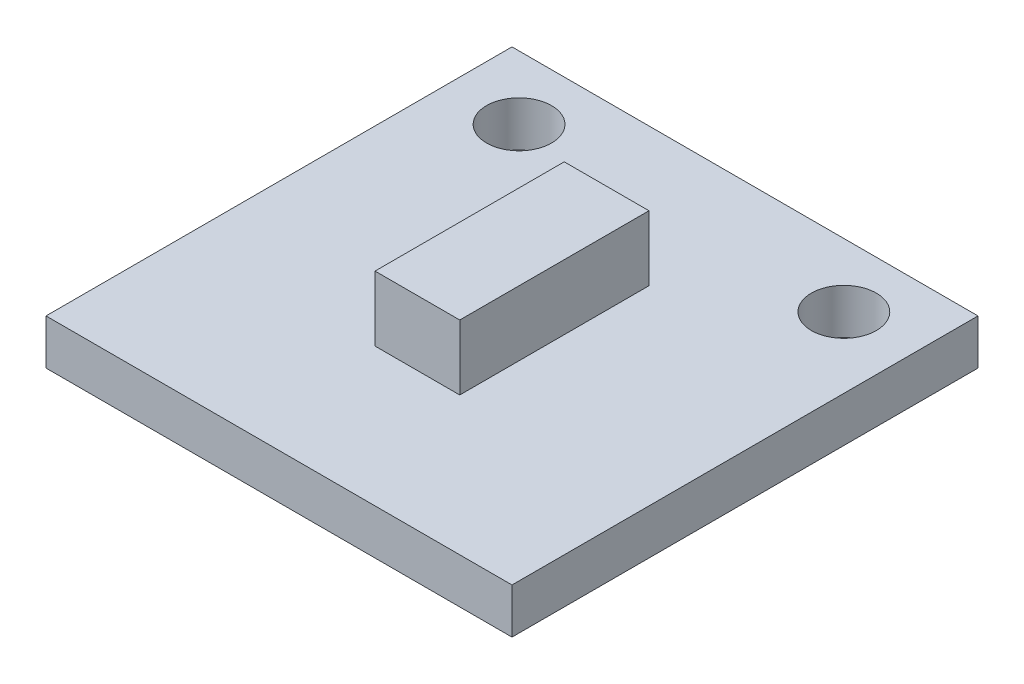
ISO-10303-21;
HEADER;
FILE_DESCRIPTION(('STEP AP214'),'2;1');
FILE_NAME('part.step','',(''),(''),'','','');
FILE_SCHEMA(('AUTOMOTIVE_DESIGN { 1 0 10303 214 1 1 1 1 }'));
ENDSEC;
DATA;
#1=APPLICATION_CONTEXT('core data for automotive mechanical design processes');
#2=APPLICATION_PROTOCOL_DEFINITION('international standard','automotive_design',2000,#1);
#3=PRODUCT_CONTEXT('',#1,'mechanical');
#4=PRODUCT('Part','Part','',(#3));
#5=PRODUCT_RELATED_PRODUCT_CATEGORY('part','',(#4));
#6=PRODUCT_DEFINITION_FORMATION('','',#4);
#7=PRODUCT_DEFINITION_CONTEXT('part definition',#1,'design');
#8=PRODUCT_DEFINITION('design','',#6,#7);
#9=PRODUCT_DEFINITION_SHAPE('','',#8);
#10=(LENGTH_UNIT() NAMED_UNIT(*) SI_UNIT(.MILLI.,.METRE.));
#11=(NAMED_UNIT(*) PLANE_ANGLE_UNIT() SI_UNIT($,.RADIAN.));
#12=(NAMED_UNIT(*) SI_UNIT($,.STERADIAN.) SOLID_ANGLE_UNIT());
#13=UNCERTAINTY_MEASURE_WITH_UNIT(LENGTH_MEASURE(1.E-05),#10,'distance_accuracy_value','');
#14=(GEOMETRIC_REPRESENTATION_CONTEXT(3) GLOBAL_UNCERTAINTY_ASSIGNED_CONTEXT((#13)) GLOBAL_UNIT_ASSIGNED_CONTEXT((#10,
#11,#12)) REPRESENTATION_CONTEXT('',''));
#15=CARTESIAN_POINT('',(0.,0.,0.));
#16=DIRECTION('',(0.,0.,1.));
#17=DIRECTION('',(1.,0.,0.));
#18=AXIS2_PLACEMENT_3D('',#15,#16,#17);
#19=CARTESIAN_POINT('',(0.,1.6,0.));
#20=DIRECTION('',(0.,-1.,0.));
#21=DIRECTION('',(0.,0.,-1.));
#22=AXIS2_PLACEMENT_3D('',#19,#20,#21);
#23=PLANE('',#22);
#24=CARTESIAN_POINT('',(5.75,1.6,-6.));
#25=DIRECTION('',(0.,1.,0.));
#26=DIRECTION('',(0.,0.,1.));
#27=AXIS2_PLACEMENT_3D('',#24,#25,#26);
#28=CIRCLE('',#27,1.15);
#29=CARTESIAN_POINT('',(5.75,1.6,-4.85));
#30=VERTEX_POINT('',#29);
#31=EDGE_CURVE('E120',#30,#30,#28,.T.);
#32=ORIENTED_EDGE('',*,*,#31,.F.);
#33=EDGE_LOOP('',(#32));
#34=FACE_BOUND('',#33,.T.);
#35=CARTESIAN_POINT('',(-5.75,1.6,-6.));
#36=DIRECTION('',(0.,1.,0.));
#37=DIRECTION('',(0.,0.,1.));
#38=AXIS2_PLACEMENT_3D('',#35,#36,#37);
#39=CIRCLE('',#38,1.15);
#40=CARTESIAN_POINT('',(-5.75,1.6,-4.85));
#41=VERTEX_POINT('',#40);
#42=EDGE_CURVE('E129',#41,#41,#39,.T.);
#43=ORIENTED_EDGE('',*,*,#42,.F.);
#44=EDGE_LOOP('',(#43));
#45=FACE_BOUND('',#44,.T.);
#46=DIRECTION('',(0.,0.,-1.));
#47=VECTOR('',#46,1.);
#48=CARTESIAN_POINT('',(8.25,1.6,8.25));
#49=LINE('',#48,#47);
#50=CARTESIAN_POINT('',(8.25,1.6,8.25));
#51=VERTEX_POINT('',#50);
#52=CARTESIAN_POINT('',(8.25,1.6,-8.25));
#53=VERTEX_POINT('',#52);
#54=EDGE_CURVE('E135',#51,#53,#49,.T.);
#55=ORIENTED_EDGE('',*,*,#54,.T.);
#56=DIRECTION('',(-1.,0.,0.));
#57=VECTOR('',#56,1.);
#58=CARTESIAN_POINT('',(-8.25,1.6,-8.25));
#59=LINE('',#58,#57);
#60=CARTESIAN_POINT('',(-8.25,1.6,-8.25));
#61=VERTEX_POINT('',#60);
#62=EDGE_CURVE('E138',#53,#61,#59,.T.);
#63=ORIENTED_EDGE('',*,*,#62,.T.);
#64=DIRECTION('',(0.,0.,1.));
#65=VECTOR('',#64,1.);
#66=CARTESIAN_POINT('',(-8.25,1.6,8.25));
#67=LINE('',#66,#65);
#68=CARTESIAN_POINT('',(-8.25,1.6,8.25));
#69=VERTEX_POINT('',#68);
#70=EDGE_CURVE('E141',#61,#69,#67,.T.);
#71=ORIENTED_EDGE('',*,*,#70,.T.);
#72=DIRECTION('',(1.,0.,0.));
#73=VECTOR('',#72,1.);
#74=CARTESIAN_POINT('',(-8.25,1.6,8.25));
#75=LINE('',#74,#73);
#76=EDGE_CURVE('E143',#69,#51,#75,.T.);
#77=ORIENTED_EDGE('',*,*,#76,.T.);
#78=EDGE_LOOP('',(#55,#63,#71,#77));
#79=FACE_BOUND('',#78,.T.);
#80=DIRECTION('',(0.,0.,-1.));
#81=VECTOR('',#80,1.);
#82=CARTESIAN_POINT('',(1.5,1.6,3.35));
#83=LINE('',#82,#81);
#84=CARTESIAN_POINT('',(1.5,1.6,3.35));
#85=VERTEX_POINT('',#84);
#86=CARTESIAN_POINT('',(1.5,1.6,-3.35));
#87=VERTEX_POINT('',#86);
#88=EDGE_CURVE('E47',#85,#87,#83,.T.);
#89=ORIENTED_EDGE('',*,*,#88,.F.);
#90=DIRECTION('',(1.,0.,0.));
#91=VECTOR('',#90,1.);
#92=CARTESIAN_POINT('',(-1.5,1.6,3.35));
#93=LINE('',#92,#91);
#94=CARTESIAN_POINT('',(-1.5,1.6,3.35));
#95=VERTEX_POINT('',#94);
#96=EDGE_CURVE('E51',#95,#85,#93,.T.);
#97=ORIENTED_EDGE('',*,*,#96,.F.);
#98=DIRECTION('',(0.,0.,1.));
#99=VECTOR('',#98,1.);
#100=CARTESIAN_POINT('',(-1.5,1.6,3.35));
#101=LINE('',#100,#99);
#102=CARTESIAN_POINT('',(-1.5,1.6,-3.35));
#103=VERTEX_POINT('',#102);
#104=EDGE_CURVE('E300',#103,#95,#101,.T.);
#105=ORIENTED_EDGE('',*,*,#104,.F.);
#106=DIRECTION('',(-1.,0.,0.));
#107=VECTOR('',#106,1.);
#108=CARTESIAN_POINT('',(-1.5,1.6,-3.35));
#109=LINE('',#108,#107);
#110=EDGE_CURVE('E306',#87,#103,#109,.T.);
#111=ORIENTED_EDGE('',*,*,#110,.F.);
#112=EDGE_LOOP('',(#89,#97,#105,#111));
#113=FACE_BOUND('',#112,.T.);
#114=ADVANCED_FACE('F32',(#34,#45,#79,#113),#23,.F.);
#115=CARTESIAN_POINT('',(0.,0.,0.));
#116=DIRECTION('',(0.,-1.,0.));
#117=DIRECTION('',(0.,0.,-1.));
#118=AXIS2_PLACEMENT_3D('',#115,#116,#117);
#119=PLANE('',#118);
#120=CARTESIAN_POINT('',(-5.75,0.,-6.));
#121=DIRECTION('',(0.,1.,0.));
#122=DIRECTION('',(0.,0.,1.));
#123=AXIS2_PLACEMENT_3D('',#120,#121,#122);
#124=CIRCLE('',#123,1.15);
#125=CARTESIAN_POINT('',(-5.75,0.,-4.85));
#126=VERTEX_POINT('',#125);
#127=EDGE_CURVE('E127',#126,#126,#124,.T.);
#128=ORIENTED_EDGE('',*,*,#127,.T.);
#129=EDGE_LOOP('',(#128));
#130=FACE_BOUND('',#129,.T.);
#131=DIRECTION('',(0.,0.,-1.));
#132=VECTOR('',#131,1.);
#133=CARTESIAN_POINT('',(8.25,0.,8.25));
#134=LINE('',#133,#132);
#135=CARTESIAN_POINT('',(8.25,0.,8.25));
#136=VERTEX_POINT('',#135);
#137=CARTESIAN_POINT('',(8.25,0.,-8.25));
#138=VERTEX_POINT('',#137);
#139=EDGE_CURVE('E132',#136,#138,#134,.T.);
#140=ORIENTED_EDGE('',*,*,#139,.F.);
#141=DIRECTION('',(1.,0.,0.));
#142=VECTOR('',#141,1.);
#143=CARTESIAN_POINT('',(-8.25,0.,8.25));
#144=LINE('',#143,#142);
#145=CARTESIAN_POINT('',(-8.25,0.,8.25));
#146=VERTEX_POINT('',#145);
#147=EDGE_CURVE('E139',#146,#136,#144,.T.);
#148=ORIENTED_EDGE('',*,*,#147,.F.);
#149=DIRECTION('',(0.,0.,1.));
#150=VECTOR('',#149,1.);
#151=CARTESIAN_POINT('',(-8.25,0.,8.25));
#152=LINE('',#151,#150);
#153=CARTESIAN_POINT('',(-8.25,0.,-8.25));
#154=VERTEX_POINT('',#153);
#155=EDGE_CURVE('E150',#154,#146,#152,.T.);
#156=ORIENTED_EDGE('',*,*,#155,.F.);
#157=DIRECTION('',(-1.,0.,0.));
#158=VECTOR('',#157,1.);
#159=CARTESIAN_POINT('',(-8.25,0.,-8.25));
#160=LINE('',#159,#158);
#161=EDGE_CURVE('E148',#138,#154,#160,.T.);
#162=ORIENTED_EDGE('',*,*,#161,.F.);
#163=EDGE_LOOP('',(#140,#148,#156,#162));
#164=FACE_BOUND('',#163,.T.);
#165=CARTESIAN_POINT('',(5.75,0.,-6.));
#166=DIRECTION('',(0.,1.,0.));
#167=DIRECTION('',(0.,0.,1.));
#168=AXIS2_PLACEMENT_3D('',#165,#166,#167);
#169=CIRCLE('',#168,1.15);
#170=CARTESIAN_POINT('',(5.75,0.,-4.85));
#171=VERTEX_POINT('',#170);
#172=EDGE_CURVE('E117',#171,#171,#169,.T.);
#173=ORIENTED_EDGE('',*,*,#172,.T.);
#174=EDGE_LOOP('',(#173));
#175=FACE_BOUND('',#174,.T.);
#176=ADVANCED_FACE('F168',(#130,#164,#175),#119,.T.);
#177=CARTESIAN_POINT('',(8.25,1.6,8.25));
#178=DIRECTION('',(-1.,0.,0.));
#179=DIRECTION('',(0.,0.,1.));
#180=AXIS2_PLACEMENT_3D('',#177,#178,#179);
#181=PLANE('',#180);
#182=ORIENTED_EDGE('',*,*,#139,.T.);
#183=DIRECTION('',(0.,-1.,0.));
#184=VECTOR('',#183,1.);
#185=CARTESIAN_POINT('',(8.25,1.6,-8.25));
#186=LINE('',#185,#184);
#187=EDGE_CURVE('E11',#53,#138,#186,.T.);
#188=ORIENTED_EDGE('',*,*,#187,.F.);
#189=ORIENTED_EDGE('',*,*,#54,.F.);
#190=DIRECTION('',(0.,-1.,0.));
#191=VECTOR('',#190,1.);
#192=CARTESIAN_POINT('',(8.25,1.6,8.25));
#193=LINE('',#192,#191);
#194=EDGE_CURVE('E145',#51,#136,#193,.T.);
#195=ORIENTED_EDGE('',*,*,#194,.T.);
#196=EDGE_LOOP('',(#182,#188,#189,#195));
#197=FACE_BOUND('',#196,.T.);
#198=ADVANCED_FACE('F34',(#197),#181,.F.);
#199=CARTESIAN_POINT('',(-8.25,1.6,-8.25));
#200=DIRECTION('',(0.,0.,1.));
#201=DIRECTION('',(1.,0.,0.));
#202=AXIS2_PLACEMENT_3D('',#199,#200,#201);
#203=PLANE('',#202);
#204=ORIENTED_EDGE('',*,*,#161,.T.);
#205=DIRECTION('',(0.,-1.,0.));
#206=VECTOR('',#205,1.);
#207=CARTESIAN_POINT('',(-8.25,1.6,-8.25));
#208=LINE('',#207,#206);
#209=EDGE_CURVE('E40',#61,#154,#208,.T.);
#210=ORIENTED_EDGE('',*,*,#209,.F.);
#211=ORIENTED_EDGE('',*,*,#62,.F.);
#212=ORIENTED_EDGE('',*,*,#187,.T.);
#213=EDGE_LOOP('',(#204,#210,#211,#212));
#214=FACE_BOUND('',#213,.T.);
#215=ADVANCED_FACE('F178',(#214),#203,.F.);
#216=CARTESIAN_POINT('',(-8.25,1.6,8.25));
#217=DIRECTION('',(1.,0.,0.));
#218=DIRECTION('',(0.,0.,-1.));
#219=AXIS2_PLACEMENT_3D('',#216,#217,#218);
#220=PLANE('',#219);
#221=ORIENTED_EDGE('',*,*,#155,.T.);
#222=DIRECTION('',(0.,-1.,0.));
#223=VECTOR('',#222,1.);
#224=CARTESIAN_POINT('',(-8.25,1.6,8.25));
#225=LINE('',#224,#223);
#226=EDGE_CURVE('E155',#69,#146,#225,.T.);
#227=ORIENTED_EDGE('',*,*,#226,.F.);
#228=ORIENTED_EDGE('',*,*,#70,.F.);
#229=ORIENTED_EDGE('',*,*,#209,.T.);
#230=EDGE_LOOP('',(#221,#227,#228,#229));
#231=FACE_BOUND('',#230,.T.);
#232=ADVANCED_FACE('F162',(#231),#220,.F.);
#233=CARTESIAN_POINT('',(-8.25,1.6,8.25));
#234=DIRECTION('',(0.,0.,-1.));
#235=DIRECTION('',(-1.,0.,0.));
#236=AXIS2_PLACEMENT_3D('',#233,#234,#235);
#237=PLANE('',#236);
#238=ORIENTED_EDGE('',*,*,#147,.T.);
#239=ORIENTED_EDGE('',*,*,#194,.F.);
#240=ORIENTED_EDGE('',*,*,#76,.F.);
#241=ORIENTED_EDGE('',*,*,#226,.T.);
#242=EDGE_LOOP('',(#238,#239,#240,#241));
#243=FACE_BOUND('',#242,.T.);
#244=ADVANCED_FACE('F172',(#243),#237,.F.);
#245=CARTESIAN_POINT('',(-5.75,1.6,-6.));
#246=DIRECTION('',(0.,-1.,0.));
#247=DIRECTION('',(0.,0.,-1.));
#248=AXIS2_PLACEMENT_3D('',#245,#246,#247);
#249=CYLINDRICAL_SURFACE('',#248,1.15);
#250=ORIENTED_EDGE('',*,*,#42,.T.);
#251=EDGE_LOOP('',(#250));
#252=FACE_BOUND('',#251,.T.);
#253=ORIENTED_EDGE('',*,*,#127,.F.);
#254=EDGE_LOOP('',(#253));
#255=FACE_BOUND('',#254,.T.);
#256=ADVANCED_FACE('F196',(#252,#255),#249,.F.);
#257=CARTESIAN_POINT('',(5.75,1.6,-6.));
#258=DIRECTION('',(0.,-1.,0.));
#259=DIRECTION('',(0.,0.,-1.));
#260=AXIS2_PLACEMENT_3D('',#257,#258,#259);
#261=CYLINDRICAL_SURFACE('',#260,1.15);
#262=ORIENTED_EDGE('',*,*,#31,.T.);
#263=EDGE_LOOP('',(#262));
#264=FACE_BOUND('',#263,.T.);
#265=ORIENTED_EDGE('',*,*,#172,.F.);
#266=EDGE_LOOP('',(#265));
#267=FACE_BOUND('',#266,.T.);
#268=ADVANCED_FACE('F203',(#264,#267),#261,.F.);
#269=CARTESIAN_POINT('',(1.5,3.9,3.35));
#270=DIRECTION('',(-1.,0.,0.));
#271=DIRECTION('',(0.,0.,1.));
#272=AXIS2_PLACEMENT_3D('',#269,#270,#271);
#273=PLANE('',#272);
#274=ORIENTED_EDGE('',*,*,#88,.T.);
#275=DIRECTION('',(0.,-1.,0.));
#276=VECTOR('',#275,1.);
#277=CARTESIAN_POINT('',(1.5,3.9,-3.35));
#278=LINE('',#277,#276);
#279=CARTESIAN_POINT('',(1.5,3.9,-3.35));
#280=VERTEX_POINT('',#279);
#281=EDGE_CURVE('E100',#280,#87,#278,.T.);
#282=ORIENTED_EDGE('',*,*,#281,.F.);
#283=DIRECTION('',(0.,0.,-1.));
#284=VECTOR('',#283,1.);
#285=CARTESIAN_POINT('',(1.5,3.9,3.35));
#286=LINE('',#285,#284);
#287=CARTESIAN_POINT('',(1.5,3.9,3.35));
#288=VERTEX_POINT('',#287);
#289=EDGE_CURVE('E106',#288,#280,#286,.T.);
#290=ORIENTED_EDGE('',*,*,#289,.F.);
#291=DIRECTION('',(0.,-1.,0.));
#292=VECTOR('',#291,1.);
#293=CARTESIAN_POINT('',(1.5,3.9,3.35));
#294=LINE('',#293,#292);
#295=EDGE_CURVE('E298',#288,#85,#294,.T.);
#296=ORIENTED_EDGE('',*,*,#295,.T.);
#297=EDGE_LOOP('',(#274,#282,#290,#296));
#298=FACE_BOUND('',#297,.T.);
#299=ADVANCED_FACE('F116',(#298),#273,.F.);
#300=CARTESIAN_POINT('',(-1.5,3.9,-3.35));
#301=DIRECTION('',(0.,0.,1.));
#302=DIRECTION('',(1.,0.,0.));
#303=AXIS2_PLACEMENT_3D('',#300,#301,#302);
#304=PLANE('',#303);
#305=ORIENTED_EDGE('',*,*,#110,.T.);
#306=DIRECTION('',(0.,-1.,0.));
#307=VECTOR('',#306,1.);
#308=CARTESIAN_POINT('',(-1.5,3.9,-3.35));
#309=LINE('',#308,#307);
#310=CARTESIAN_POINT('',(-1.5,3.9,-3.35));
#311=VERTEX_POINT('',#310);
#312=EDGE_CURVE('E102',#311,#103,#309,.T.);
#313=ORIENTED_EDGE('',*,*,#312,.F.);
#314=DIRECTION('',(-1.,0.,0.));
#315=VECTOR('',#314,1.);
#316=CARTESIAN_POINT('',(-1.5,3.9,-3.35));
#317=LINE('',#316,#315);
#318=EDGE_CURVE('E95',#280,#311,#317,.T.);
#319=ORIENTED_EDGE('',*,*,#318,.F.);
#320=ORIENTED_EDGE('',*,*,#281,.T.);
#321=EDGE_LOOP('',(#305,#313,#319,#320));
#322=FACE_BOUND('',#321,.T.);
#323=ADVANCED_FACE('F98',(#322),#304,.F.);
#324=CARTESIAN_POINT('',(-1.5,3.9,3.35));
#325=DIRECTION('',(1.,0.,0.));
#326=DIRECTION('',(0.,0.,-1.));
#327=AXIS2_PLACEMENT_3D('',#324,#325,#326);
#328=PLANE('',#327);
#329=ORIENTED_EDGE('',*,*,#104,.T.);
#330=DIRECTION('',(0.,-1.,0.));
#331=VECTOR('',#330,1.);
#332=CARTESIAN_POINT('',(-1.5,3.9,3.35));
#333=LINE('',#332,#331);
#334=CARTESIAN_POINT('',(-1.5,3.9,3.35));
#335=VERTEX_POINT('',#334);
#336=EDGE_CURVE('E122',#335,#95,#333,.T.);
#337=ORIENTED_EDGE('',*,*,#336,.F.);
#338=DIRECTION('',(0.,0.,1.));
#339=VECTOR('',#338,1.);
#340=CARTESIAN_POINT('',(-1.5,3.9,3.35));
#341=LINE('',#340,#339);
#342=EDGE_CURVE('E105',#311,#335,#341,.T.);
#343=ORIENTED_EDGE('',*,*,#342,.F.);
#344=ORIENTED_EDGE('',*,*,#312,.T.);
#345=EDGE_LOOP('',(#329,#337,#343,#344));
#346=FACE_BOUND('',#345,.T.);
#347=ADVANCED_FACE('F220',(#346),#328,.F.);
#348=CARTESIAN_POINT('',(-1.5,3.9,3.35));
#349=DIRECTION('',(0.,0.,-1.));
#350=DIRECTION('',(-1.,0.,0.));
#351=AXIS2_PLACEMENT_3D('',#348,#349,#350);
#352=PLANE('',#351);
#353=ORIENTED_EDGE('',*,*,#96,.T.);
#354=ORIENTED_EDGE('',*,*,#295,.F.);
#355=DIRECTION('',(1.,0.,0.));
#356=VECTOR('',#355,1.);
#357=CARTESIAN_POINT('',(-1.5,3.9,3.35));
#358=LINE('',#357,#356);
#359=EDGE_CURVE('E111',#335,#288,#358,.T.);
#360=ORIENTED_EDGE('',*,*,#359,.F.);
#361=ORIENTED_EDGE('',*,*,#336,.T.);
#362=EDGE_LOOP('',(#353,#354,#360,#361));
#363=FACE_BOUND('',#362,.T.);
#364=ADVANCED_FACE('F223',(#363),#352,.F.);
#365=CARTESIAN_POINT('',(0.,3.9,0.));
#366=DIRECTION('',(0.,-1.,0.));
#367=DIRECTION('',(0.,0.,-1.));
#368=AXIS2_PLACEMENT_3D('',#365,#366,#367);
#369=PLANE('',#368);
#370=ORIENTED_EDGE('',*,*,#289,.T.);
#371=ORIENTED_EDGE('',*,*,#318,.T.);
#372=ORIENTED_EDGE('',*,*,#342,.T.);
#373=ORIENTED_EDGE('',*,*,#359,.T.);
#374=EDGE_LOOP('',(#370,#371,#372,#373));
#375=FACE_BOUND('',#374,.T.);
#376=ADVANCED_FACE('F109',(#375),#369,.F.);
#377=CLOSED_SHELL('',(#114,#176,#198,#215,#232,#244,#256,#268,#299,#323,#347,#364,#376));
#378=MANIFOLD_SOLID_BREP('B2',#377);
#379=ADVANCED_BREP_SHAPE_REPRESENTATION('',(#18,#378),#14);
#380=SHAPE_DEFINITION_REPRESENTATION(#9,#379);
ENDSEC;
END-ISO-10303-21;
